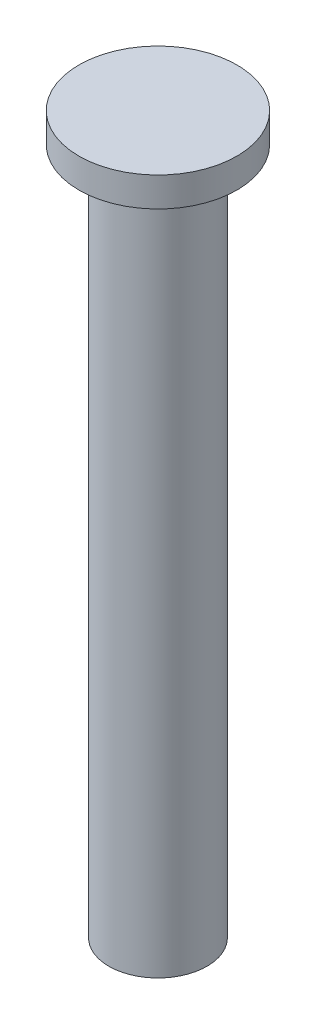
ISO-10303-21;
HEADER;
FILE_DESCRIPTION(('STEP AP214'),'2;1');
FILE_NAME('part.step','',(''),(''),'','','');
FILE_SCHEMA(('AUTOMOTIVE_DESIGN { 1 0 10303 214 1 1 1 1 }'));
ENDSEC;
DATA;
#1=APPLICATION_CONTEXT('core data for automotive mechanical design processes');
#2=APPLICATION_PROTOCOL_DEFINITION('international standard','automotive_design',2000,#1);
#3=PRODUCT_CONTEXT('',#1,'mechanical');
#4=PRODUCT('Part','Part','',(#3));
#5=PRODUCT_RELATED_PRODUCT_CATEGORY('part','',(#4));
#6=PRODUCT_DEFINITION_FORMATION('','',#4);
#7=PRODUCT_DEFINITION_CONTEXT('part definition',#1,'design');
#8=PRODUCT_DEFINITION('design','',#6,#7);
#9=PRODUCT_DEFINITION_SHAPE('','',#8);
#10=(LENGTH_UNIT() NAMED_UNIT(*) SI_UNIT(.MILLI.,.METRE.));
#11=(NAMED_UNIT(*) PLANE_ANGLE_UNIT() SI_UNIT($,.RADIAN.));
#12=(NAMED_UNIT(*) SI_UNIT($,.STERADIAN.) SOLID_ANGLE_UNIT());
#13=UNCERTAINTY_MEASURE_WITH_UNIT(LENGTH_MEASURE(1.E-05),#10,'distance_accuracy_value','');
#14=(GEOMETRIC_REPRESENTATION_CONTEXT(3) GLOBAL_UNCERTAINTY_ASSIGNED_CONTEXT((#13)) GLOBAL_UNIT_ASSIGNED_CONTEXT((#10,
#11,#12)) REPRESENTATION_CONTEXT('',''));
#15=CARTESIAN_POINT('',(0.,0.,0.));
#16=DIRECTION('',(0.,0.,1.));
#17=DIRECTION('',(1.,0.,0.));
#18=AXIS2_PLACEMENT_3D('',#15,#16,#17);
#19=CARTESIAN_POINT('',(0.,35.,0.));
#20=DIRECTION('',(0.,-1.,0.));
#21=DIRECTION('',(0.,0.,-1.));
#22=AXIS2_PLACEMENT_3D('',#19,#20,#21);
#23=CYLINDRICAL_SURFACE('',#22,2.5);
#24=CARTESIAN_POINT('',(0.,35.,0.));
#25=DIRECTION('',(0.,1.,0.));
#26=DIRECTION('',(0.,0.,1.));
#27=AXIS2_PLACEMENT_3D('',#24,#25,#26);
#28=CIRCLE('',#27,2.5);
#29=CARTESIAN_POINT('',(0.,35.,2.5));
#30=VERTEX_POINT('',#29);
#31=EDGE_CURVE('E10',#30,#30,#28,.T.);
#32=ORIENTED_EDGE('',*,*,#31,.F.);
#33=EDGE_LOOP('',(#32));
#34=FACE_BOUND('',#33,.T.);
#35=CARTESIAN_POINT('',(0.,0.,0.));
#36=DIRECTION('',(0.,1.,0.));
#37=DIRECTION('',(0.,0.,1.));
#38=AXIS2_PLACEMENT_3D('',#35,#36,#37);
#39=CIRCLE('',#38,2.5);
#40=CARTESIAN_POINT('',(0.,0.,2.5));
#41=VERTEX_POINT('',#40);
#42=EDGE_CURVE('E35',#41,#41,#39,.T.);
#43=ORIENTED_EDGE('',*,*,#42,.T.);
#44=EDGE_LOOP('',(#43));
#45=FACE_BOUND('',#44,.T.);
#46=ADVANCED_FACE('F32',(#34,#45),#23,.T.);
#47=CARTESIAN_POINT('',(0.,0.,0.));
#48=DIRECTION('',(0.,1.,0.));
#49=DIRECTION('',(0.,0.,1.));
#50=AXIS2_PLACEMENT_3D('',#47,#48,#49);
#51=PLANE('',#50);
#52=ORIENTED_EDGE('',*,*,#42,.F.);
#53=EDGE_LOOP('',(#52));
#54=FACE_BOUND('',#53,.T.);
#55=ADVANCED_FACE('F55',(#54),#51,.F.);
#56=CARTESIAN_POINT('',(0.,36.5,0.));
#57=DIRECTION('',(0.,-1.,0.));
#58=DIRECTION('',(0.,0.,-1.));
#59=AXIS2_PLACEMENT_3D('',#56,#57,#58);
#60=CYLINDRICAL_SURFACE('',#59,4.02455144185109);
#61=CARTESIAN_POINT('',(0.,36.5,0.));
#62=DIRECTION('',(0.,1.,0.));
#63=DIRECTION('',(0.,0.,1.));
#64=AXIS2_PLACEMENT_3D('',#61,#62,#63);
#65=CIRCLE('',#64,4.02455144185109);
#66=CARTESIAN_POINT('',(0.,36.5,4.02455144185109));
#67=VERTEX_POINT('',#66);
#68=EDGE_CURVE('E42',#67,#67,#65,.T.);
#69=ORIENTED_EDGE('',*,*,#68,.F.);
#70=EDGE_LOOP('',(#69));
#71=FACE_BOUND('',#70,.T.);
#72=CARTESIAN_POINT('',(0.,35.,0.));
#73=DIRECTION('',(0.,1.,0.));
#74=DIRECTION('',(0.,0.,1.));
#75=AXIS2_PLACEMENT_3D('',#72,#73,#74);
#76=CIRCLE('',#75,4.02455144185109);
#77=CARTESIAN_POINT('',(0.,35.,4.02455144185109));
#78=VERTEX_POINT('',#77);
#79=EDGE_CURVE('E44',#78,#78,#76,.T.);
#80=ORIENTED_EDGE('',*,*,#79,.T.);
#81=EDGE_LOOP('',(#80));
#82=FACE_BOUND('',#81,.T.);
#83=ADVANCED_FACE('F52',(#71,#82),#60,.T.);
#84=CARTESIAN_POINT('',(0.,36.5,0.));
#85=DIRECTION('',(0.,1.,0.));
#86=DIRECTION('',(0.,0.,1.));
#87=AXIS2_PLACEMENT_3D('',#84,#85,#86);
#88=PLANE('',#87);
#89=ORIENTED_EDGE('',*,*,#68,.T.);
#90=EDGE_LOOP('',(#89));
#91=FACE_BOUND('',#90,.T.);
#92=ADVANCED_FACE('F50',(#91),#88,.T.);
#93=CARTESIAN_POINT('',(0.,35.,0.));
#94=DIRECTION('',(0.,1.,0.));
#95=DIRECTION('',(0.,0.,1.));
#96=AXIS2_PLACEMENT_3D('',#93,#94,#95);
#97=PLANE('',#96);
#98=ORIENTED_EDGE('',*,*,#31,.T.);
#99=EDGE_LOOP('',(#98));
#100=FACE_BOUND('',#99,.T.);
#101=ORIENTED_EDGE('',*,*,#79,.F.);
#102=EDGE_LOOP('',(#101));
#103=FACE_BOUND('',#102,.T.);
#104=ADVANCED_FACE('F59',(#100,#103),#97,.F.);
#105=CLOSED_SHELL('',(#46,#55,#83,#92,#104));
#106=MANIFOLD_SOLID_BREP('B2',#105);
#107=ADVANCED_BREP_SHAPE_REPRESENTATION('',(#18,#106),#14);
#108=SHAPE_DEFINITION_REPRESENTATION(#9,#107);
ENDSEC;
END-ISO-10303-21;
